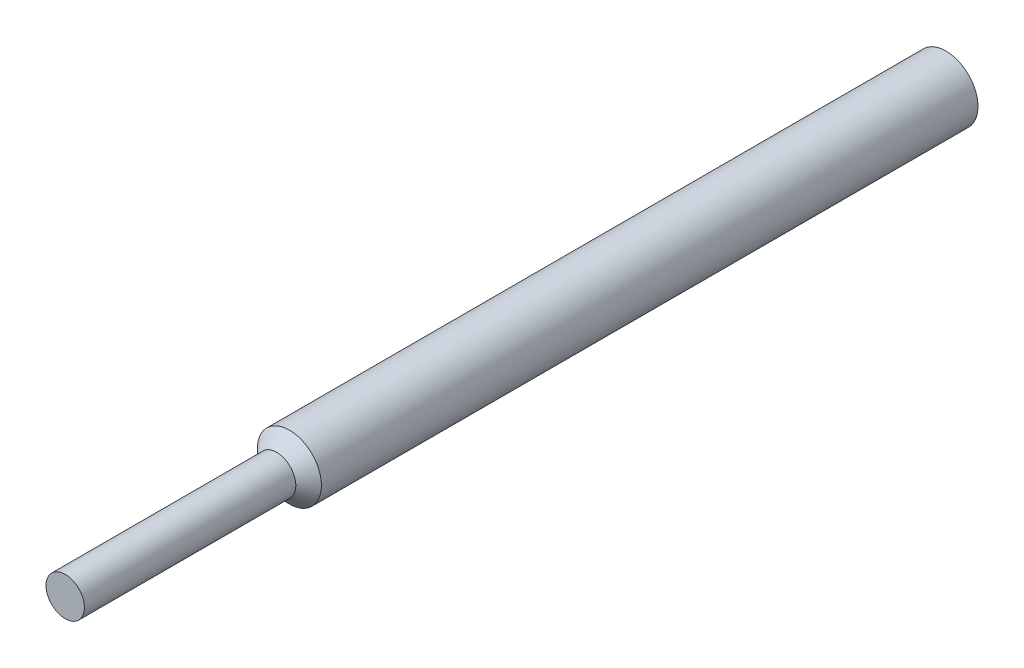
ISO-10303-21;
HEADER;
FILE_DESCRIPTION(('STEP AP214'),'2;1');
FILE_NAME('part.step','',(''),(''),'','','');
FILE_SCHEMA(('AUTOMOTIVE_DESIGN { 1 0 10303 214 1 1 1 1 }'));
ENDSEC;
DATA;
#1=APPLICATION_CONTEXT('core data for automotive mechanical design processes');
#2=APPLICATION_PROTOCOL_DEFINITION('international standard','automotive_design',2000,#1);
#3=PRODUCT_CONTEXT('',#1,'mechanical');
#4=PRODUCT('Part','Part','',(#3));
#5=PRODUCT_RELATED_PRODUCT_CATEGORY('part','',(#4));
#6=PRODUCT_DEFINITION_FORMATION('','',#4);
#7=PRODUCT_DEFINITION_CONTEXT('part definition',#1,'design');
#8=PRODUCT_DEFINITION('design','',#6,#7);
#9=PRODUCT_DEFINITION_SHAPE('','',#8);
#10=(LENGTH_UNIT() NAMED_UNIT(*) SI_UNIT(.MILLI.,.METRE.));
#11=(NAMED_UNIT(*) PLANE_ANGLE_UNIT() SI_UNIT($,.RADIAN.));
#12=(NAMED_UNIT(*) SI_UNIT($,.STERADIAN.) SOLID_ANGLE_UNIT());
#13=UNCERTAINTY_MEASURE_WITH_UNIT(LENGTH_MEASURE(1.E-05),#10,'distance_accuracy_value','');
#14=(GEOMETRIC_REPRESENTATION_CONTEXT(3) GLOBAL_UNCERTAINTY_ASSIGNED_CONTEXT((#13)) GLOBAL_UNIT_ASSIGNED_CONTEXT((#10,
#11,#12)) REPRESENTATION_CONTEXT('',''));
#15=CARTESIAN_POINT('',(0.,0.,0.));
#16=DIRECTION('',(0.,0.,1.));
#17=DIRECTION('',(1.,0.,0.));
#18=AXIS2_PLACEMENT_3D('',#15,#16,#17);
#19=CARTESIAN_POINT('',(0.,0.,0.));
#20=DIRECTION('',(0.,0.,1.));
#21=DIRECTION('',(0.,-1.,0.));
#22=AXIS2_PLACEMENT_3D('',#19,#20,#21);
#23=PLANE('',#22);
#24=CARTESIAN_POINT('',(0.,0.,0.));
#25=DIRECTION('',(0.,0.,-1.));
#26=DIRECTION('',(0.,1.,0.));
#27=AXIS2_PLACEMENT_3D('',#24,#25,#26);
#28=CIRCLE('',#27,6.);
#29=CARTESIAN_POINT('',(0.,6.,0.));
#30=VERTEX_POINT('',#29);
#31=EDGE_CURVE('E54',#30,#30,#28,.T.);
#32=ORIENTED_EDGE('',*,*,#31,.F.);
#33=EDGE_LOOP('',(#32));
#34=FACE_BOUND('',#33,.T.);
#35=ADVANCED_FACE('F45',(#34),#23,.T.);
#36=CARTESIAN_POINT('',(0.,0.,-275.));
#37=DIRECTION('',(0.,0.,-1.));
#38=DIRECTION('',(0.,1.,0.));
#39=AXIS2_PLACEMENT_3D('',#36,#37,#38);
#40=CYLINDRICAL_SURFACE('',#39,6.);
#41=ORIENTED_EDGE('',*,*,#31,.T.);
#42=EDGE_LOOP('',(#41));
#43=FACE_BOUND('',#42,.T.);
#44=CARTESIAN_POINT('',(0.,0.,-66.));
#45=DIRECTION('',(0.,0.,-1.));
#46=DIRECTION('',(0.,1.,0.));
#47=AXIS2_PLACEMENT_3D('',#44,#45,#46);
#48=CIRCLE('',#47,5.99999999999999);
#49=CARTESIAN_POINT('',(0.,6.,-66.));
#50=VERTEX_POINT('',#49);
#51=EDGE_CURVE('E59',#50,#50,#48,.T.);
#52=ORIENTED_EDGE('',*,*,#51,.F.);
#53=EDGE_LOOP('',(#52));
#54=FACE_BOUND('',#53,.T.);
#55=ADVANCED_FACE('F75',(#43,#54),#40,.T.);
#56=CARTESIAN_POINT('',(0.,0.,-275.));
#57=DIRECTION('',(0.,0.,-1.));
#58=DIRECTION('',(0.,1.,0.));
#59=AXIS2_PLACEMENT_3D('',#56,#57,#58);
#60=CYLINDRICAL_SURFACE('',#59,9.99999999999999);
#61=CARTESIAN_POINT('',(0.,0.,-70.));
#62=DIRECTION('',(0.,0.,1.));
#63=DIRECTION('',(0.,-1.,0.));
#64=AXIS2_PLACEMENT_3D('',#61,#62,#63);
#65=CIRCLE('',#64,9.99999999999999);
#66=CARTESIAN_POINT('',(0.,-9.99999999999998,-70.));
#67=VERTEX_POINT('',#66);
#68=EDGE_CURVE('E10',#67,#67,#65,.F.);
#69=ORIENTED_EDGE('',*,*,#68,.T.);
#70=EDGE_LOOP('',(#69));
#71=FACE_BOUND('',#70,.T.);
#72=CARTESIAN_POINT('',(0.,0.,-275.));
#73=DIRECTION('',(0.,0.,-1.));
#74=DIRECTION('',(0.,1.,0.));
#75=AXIS2_PLACEMENT_3D('',#72,#73,#74);
#76=CIRCLE('',#75,9.99999999999998);
#77=CARTESIAN_POINT('',(0.,10.,-275.));
#78=VERTEX_POINT('',#77);
#79=EDGE_CURVE('E64',#78,#78,#76,.T.);
#80=ORIENTED_EDGE('',*,*,#79,.F.);
#81=EDGE_LOOP('',(#80));
#82=FACE_BOUND('',#81,.T.);
#83=ADVANCED_FACE('F73',(#71,#82),#60,.T.);
#84=CARTESIAN_POINT('',(0.,10.,-275.));
#85=DIRECTION('',(0.,0.,-1.));
#86=DIRECTION('',(0.,1.,0.));
#87=AXIS2_PLACEMENT_3D('',#84,#85,#86);
#88=PLANE('',#87);
#89=ORIENTED_EDGE('',*,*,#79,.T.);
#90=EDGE_LOOP('',(#89));
#91=FACE_BOUND('',#90,.T.);
#92=ADVANCED_FACE('F71',(#91),#88,.T.);
#93=CARTESIAN_POINT('',(0.,0.,-70.));
#94=DIRECTION('',(0.,0.,-1.));
#95=DIRECTION('',(0.,1.,0.));
#96=AXIS2_PLACEMENT_3D('',#93,#94,#95);
#97=CONICAL_SURFACE('',#96,9.99999999999999,0.785398163397453);
#98=ORIENTED_EDGE('',*,*,#51,.T.);
#99=EDGE_LOOP('',(#98));
#100=FACE_BOUND('',#99,.T.);
#101=ORIENTED_EDGE('',*,*,#68,.F.);
#102=EDGE_LOOP('',(#101));
#103=FACE_BOUND('',#102,.T.);
#104=ADVANCED_FACE('F48',(#100,#103),#97,.T.);
#105=CLOSED_SHELL('',(#35,#55,#83,#92,#104));
#106=MANIFOLD_SOLID_BREP('B2',#105);
#107=ADVANCED_BREP_SHAPE_REPRESENTATION('',(#18,#106),#14);
#108=SHAPE_DEFINITION_REPRESENTATION(#9,#107);
ENDSEC;
END-ISO-10303-21;
